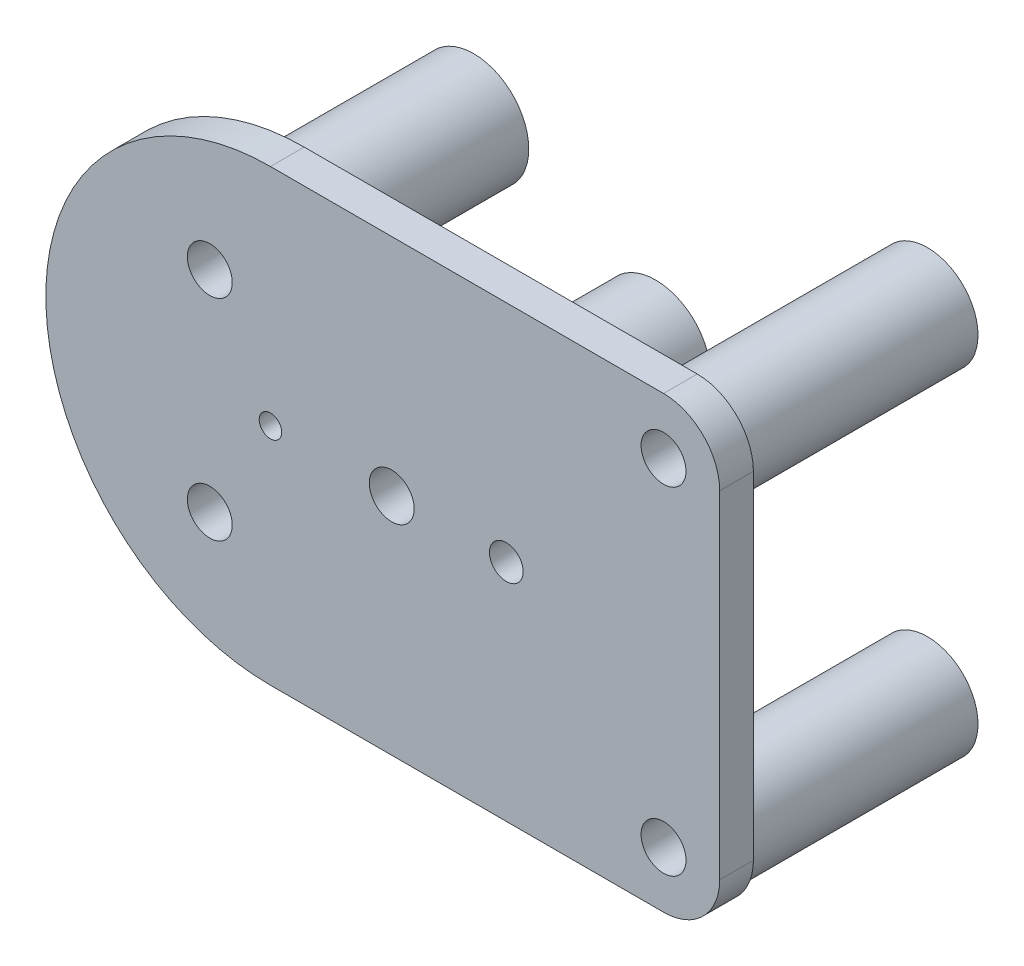
ISO-10303-21;
HEADER;
FILE_DESCRIPTION(('STEP AP214'),'2;1');
FILE_NAME('part.step','',(''),(''),'','','');
FILE_SCHEMA(('AUTOMOTIVE_DESIGN { 1 0 10303 214 1 1 1 1 }'));
ENDSEC;
DATA;
#1=APPLICATION_CONTEXT('core data for automotive mechanical design processes');
#2=APPLICATION_PROTOCOL_DEFINITION('international standard','automotive_design',2000,#1);
#3=PRODUCT_CONTEXT('',#1,'mechanical');
#4=PRODUCT('Part','Part','',(#3));
#5=PRODUCT_RELATED_PRODUCT_CATEGORY('part','',(#4));
#6=PRODUCT_DEFINITION_FORMATION('','',#4);
#7=PRODUCT_DEFINITION_CONTEXT('part definition',#1,'design');
#8=PRODUCT_DEFINITION('design','',#6,#7);
#9=PRODUCT_DEFINITION_SHAPE('','',#8);
#10=(LENGTH_UNIT() NAMED_UNIT(*) SI_UNIT(.MILLI.,.METRE.));
#11=(NAMED_UNIT(*) PLANE_ANGLE_UNIT() SI_UNIT($,.RADIAN.));
#12=(NAMED_UNIT(*) SI_UNIT($,.STERADIAN.) SOLID_ANGLE_UNIT());
#13=UNCERTAINTY_MEASURE_WITH_UNIT(LENGTH_MEASURE(1.E-05),#10,'distance_accuracy_value','');
#14=(GEOMETRIC_REPRESENTATION_CONTEXT(3) GLOBAL_UNCERTAINTY_ASSIGNED_CONTEXT((#13)) GLOBAL_UNIT_ASSIGNED_CONTEXT((#10,
#11,#12)) REPRESENTATION_CONTEXT('',''));
#15=CARTESIAN_POINT('',(0.,0.,0.));
#16=DIRECTION('',(0.,0.,1.));
#17=DIRECTION('',(1.,0.,0.));
#18=AXIS2_PLACEMENT_3D('',#15,#16,#17);
#19=CARTESIAN_POINT('',(0.,0.,0.));
#20=DIRECTION('',(0.,0.,1.));
#21=DIRECTION('',(1.,0.,0.));
#22=AXIS2_PLACEMENT_3D('',#19,#20,#21);
#23=PLANE('',#22);
#24=CARTESIAN_POINT('',(35.,15.,0.));
#25=DIRECTION('',(0.,0.,1.));
#26=DIRECTION('',(1.,0.,0.));
#27=AXIS2_PLACEMENT_3D('',#24,#25,#26);
#28=CIRCLE('',#27,4.5);
#29=CARTESIAN_POINT('',(39.5,15.,0.));
#30=VERTEX_POINT('',#29);
#31=EDGE_CURVE('E54',#30,#30,#28,.F.);
#32=ORIENTED_EDGE('',*,*,#31,.F.);
#33=EDGE_LOOP('',(#32));
#34=FACE_BOUND('',#33,.T.);
#35=CARTESIAN_POINT('',(-5.40000000000001,-9.35307436087194,0.));
#36=DIRECTION('',(0.,0.,1.));
#37=DIRECTION('',(1.,0.,0.));
#38=AXIS2_PLACEMENT_3D('',#35,#36,#37);
#39=CIRCLE('',#38,4.9);
#40=CARTESIAN_POINT('',(-0.500000000000002,-9.35307436087194,0.));
#41=VERTEX_POINT('',#40);
#42=EDGE_CURVE('E183',#41,#41,#39,.F.);
#43=ORIENTED_EDGE('',*,*,#42,.F.);
#44=EDGE_LOOP('',(#43));
#45=FACE_BOUND('',#44,.T.);
#46=CARTESIAN_POINT('',(-5.4,9.35307436087194,0.));
#47=DIRECTION('',(0.,0.,1.));
#48=DIRECTION('',(1.,0.,0.));
#49=AXIS2_PLACEMENT_3D('',#46,#47,#48);
#50=CIRCLE('',#49,4.9);
#51=CARTESIAN_POINT('',(-0.499999999999995,9.35307436087194,0.));
#52=VERTEX_POINT('',#51);
#53=EDGE_CURVE('E179',#52,#52,#50,.F.);
#54=ORIENTED_EDGE('',*,*,#53,.F.);
#55=EDGE_LOOP('',(#54));
#56=FACE_BOUND('',#55,.T.);
#57=CARTESIAN_POINT('',(10.8,0.,0.));
#58=DIRECTION('',(0.,0.,1.));
#59=DIRECTION('',(1.,0.,0.));
#60=AXIS2_PLACEMENT_3D('',#57,#58,#59);
#61=CIRCLE('',#60,4.9);
#62=CARTESIAN_POINT('',(15.7,0.,0.));
#63=VERTEX_POINT('',#62);
#64=EDGE_CURVE('E118',#63,#63,#61,.F.);
#65=ORIENTED_EDGE('',*,*,#64,.F.);
#66=EDGE_LOOP('',(#65));
#67=FACE_BOUND('',#66,.T.);
#68=DIRECTION('',(0.,-1.,0.));
#69=VECTOR('',#68,1.);
#70=CARTESIAN_POINT('',(40.,0.,0.));
#71=LINE('',#70,#69);
#72=CARTESIAN_POINT('',(40.,15.,0.));
#73=VERTEX_POINT('',#72);
#74=CARTESIAN_POINT('',(40.,-15.,0.));
#75=VERTEX_POINT('',#74);
#76=EDGE_CURVE('E157',#73,#75,#71,.T.);
#77=ORIENTED_EDGE('',*,*,#76,.T.);
#78=CARTESIAN_POINT('',(35.,-15.,0.));
#79=DIRECTION('',(0.,0.,1.));
#80=DIRECTION('',(1.,0.,0.));
#81=AXIS2_PLACEMENT_3D('',#78,#79,#80);
#82=CIRCLE('',#81,5.);
#83=CARTESIAN_POINT('',(35.,-20.,0.));
#84=VERTEX_POINT('',#83);
#85=EDGE_CURVE('E195',#75,#84,#82,.F.);
#86=ORIENTED_EDGE('',*,*,#85,.T.);
#87=DIRECTION('',(1.,0.,0.));
#88=VECTOR('',#87,1.);
#89=CARTESIAN_POINT('',(0.,-20.,0.));
#90=LINE('',#89,#88);
#91=CARTESIAN_POINT('',(0.,-20.,0.));
#92=VERTEX_POINT('',#91);
#93=EDGE_CURVE('E155',#92,#84,#90,.T.);
#94=ORIENTED_EDGE('',*,*,#93,.F.);
#95=CARTESIAN_POINT('',(0.,0.,0.));
#96=DIRECTION('',(0.,0.,1.));
#97=DIRECTION('',(1.,0.,0.));
#98=AXIS2_PLACEMENT_3D('',#95,#96,#97);
#99=CIRCLE('',#98,20.);
#100=CARTESIAN_POINT('',(0.,20.,0.));
#101=VERTEX_POINT('',#100);
#102=EDGE_CURVE('E163',#101,#92,#99,.T.);
#103=ORIENTED_EDGE('',*,*,#102,.F.);
#104=DIRECTION('',(1.,0.,0.));
#105=VECTOR('',#104,1.);
#106=CARTESIAN_POINT('',(0.,20.,0.));
#107=LINE('',#106,#105);
#108=CARTESIAN_POINT('',(35.,20.,0.));
#109=VERTEX_POINT('',#108);
#110=EDGE_CURVE('E114',#101,#109,#107,.T.);
#111=ORIENTED_EDGE('',*,*,#110,.T.);
#112=CARTESIAN_POINT('',(35.,15.,0.));
#113=DIRECTION('',(0.,0.,1.));
#114=DIRECTION('',(1.,0.,0.));
#115=AXIS2_PLACEMENT_3D('',#112,#113,#114);
#116=CIRCLE('',#115,5.);
#117=EDGE_CURVE('E193',#109,#73,#116,.F.);
#118=ORIENTED_EDGE('',*,*,#117,.T.);
#119=EDGE_LOOP('',(#77,#86,#94,#103,#111,#118));
#120=FACE_BOUND('',#119,.T.);
#121=CARTESIAN_POINT('',(21.,0.,0.));
#122=DIRECTION('',(0.,0.,1.));
#123=DIRECTION('',(1.,0.,0.));
#124=AXIS2_PLACEMENT_3D('',#121,#122,#123);
#125=CIRCLE('',#124,1.5);
#126=CARTESIAN_POINT('',(22.5,0.,0.));
#127=VERTEX_POINT('',#126);
#128=EDGE_CURVE('E166',#127,#127,#125,.T.);
#129=ORIENTED_EDGE('',*,*,#128,.T.);
#130=EDGE_LOOP('',(#129));
#131=FACE_BOUND('',#130,.T.);
#132=CARTESIAN_POINT('',(0.,0.,0.));
#133=DIRECTION('',(0.,0.,1.));
#134=DIRECTION('',(1.,0.,0.));
#135=AXIS2_PLACEMENT_3D('',#132,#133,#134);
#136=CIRCLE('',#135,1.);
#137=CARTESIAN_POINT('',(1.,0.,0.));
#138=VERTEX_POINT('',#137);
#139=EDGE_CURVE('E170',#138,#138,#136,.T.);
#140=ORIENTED_EDGE('',*,*,#139,.T.);
#141=EDGE_LOOP('',(#140));
#142=FACE_BOUND('',#141,.T.);
#143=CARTESIAN_POINT('',(35.,-15.,0.));
#144=DIRECTION('',(0.,0.,1.));
#145=DIRECTION('',(1.,0.,0.));
#146=AXIS2_PLACEMENT_3D('',#143,#144,#145);
#147=CIRCLE('',#146,4.5);
#148=CARTESIAN_POINT('',(39.5,-15.,0.));
#149=VERTEX_POINT('',#148);
#150=EDGE_CURVE('E11',#149,#149,#147,.F.);
#151=ORIENTED_EDGE('',*,*,#150,.F.);
#152=EDGE_LOOP('',(#151));
#153=FACE_BOUND('',#152,.T.);
#154=ADVANCED_FACE('F45',(#34,#45,#56,#67,#120,#131,#142,#153),#23,.F.);
#155=CARTESIAN_POINT('',(0.,-20.,3.));
#156=DIRECTION('',(0.,1.,0.));
#157=DIRECTION('',(0.,0.,1.));
#158=AXIS2_PLACEMENT_3D('',#155,#156,#157);
#159=PLANE('',#158);
#160=ORIENTED_EDGE('',*,*,#93,.T.);
#161=DIRECTION('',(0.,0.,-1.));
#162=VECTOR('',#161,1.);
#163=CARTESIAN_POINT('',(35.,-20.,3.));
#164=LINE('',#163,#162);
#165=CARTESIAN_POINT('',(35.,-20.,3.));
#166=VERTEX_POINT('',#165);
#167=EDGE_CURVE('E69',#84,#166,#164,.F.);
#168=ORIENTED_EDGE('',*,*,#167,.T.);
#169=DIRECTION('',(1.,0.,0.));
#170=VECTOR('',#169,1.);
#171=CARTESIAN_POINT('',(0.,-20.,3.));
#172=LINE('',#171,#170);
#173=CARTESIAN_POINT('',(0.,-20.,3.));
#174=VERTEX_POINT('',#173);
#175=EDGE_CURVE('E137',#174,#166,#172,.T.);
#176=ORIENTED_EDGE('',*,*,#175,.F.);
#177=DIRECTION('',(0.,0.,-1.));
#178=VECTOR('',#177,1.);
#179=CARTESIAN_POINT('',(0.,-20.,3.));
#180=LINE('',#179,#178);
#181=EDGE_CURVE('E119',#174,#92,#180,.T.);
#182=ORIENTED_EDGE('',*,*,#181,.T.);
#183=EDGE_LOOP('',(#160,#168,#176,#182));
#184=FACE_BOUND('',#183,.T.);
#185=ADVANCED_FACE('F211',(#184),#159,.F.);
#186=CARTESIAN_POINT('',(40.,0.,3.));
#187=DIRECTION('',(1.,0.,0.));
#188=DIRECTION('',(0.,0.,-1.));
#189=AXIS2_PLACEMENT_3D('',#186,#187,#188);
#190=PLANE('',#189);
#191=DIRECTION('',(0.,-1.,0.));
#192=VECTOR('',#191,1.);
#193=CARTESIAN_POINT('',(40.,0.,3.));
#194=LINE('',#193,#192);
#195=CARTESIAN_POINT('',(40.,15.,3.));
#196=VERTEX_POINT('',#195);
#197=CARTESIAN_POINT('',(40.,-15.,3.));
#198=VERTEX_POINT('',#197);
#199=EDGE_CURVE('E131',#196,#198,#194,.T.);
#200=ORIENTED_EDGE('',*,*,#199,.T.);
#201=DIRECTION('',(0.,0.,-1.));
#202=VECTOR('',#201,1.);
#203=CARTESIAN_POINT('',(40.,-15.,0.));
#204=LINE('',#203,#202);
#205=EDGE_CURVE('E190',#198,#75,#204,.T.);
#206=ORIENTED_EDGE('',*,*,#205,.T.);
#207=ORIENTED_EDGE('',*,*,#76,.F.);
#208=DIRECTION('',(0.,0.,-1.));
#209=VECTOR('',#208,1.);
#210=CARTESIAN_POINT('',(40.,15.,3.));
#211=LINE('',#210,#209);
#212=EDGE_CURVE('E187',#73,#196,#211,.F.);
#213=ORIENTED_EDGE('',*,*,#212,.T.);
#214=EDGE_LOOP('',(#200,#206,#207,#213));
#215=FACE_BOUND('',#214,.T.);
#216=ADVANCED_FACE('F288',(#215),#190,.T.);
#217=CARTESIAN_POINT('',(0.,20.,3.));
#218=DIRECTION('',(0.,1.,0.));
#219=DIRECTION('',(0.,0.,1.));
#220=AXIS2_PLACEMENT_3D('',#217,#218,#219);
#221=PLANE('',#220);
#222=DIRECTION('',(1.,0.,0.));
#223=VECTOR('',#222,1.);
#224=CARTESIAN_POINT('',(0.,20.,3.));
#225=LINE('',#224,#223);
#226=CARTESIAN_POINT('',(0.,20.,3.));
#227=VERTEX_POINT('',#226);
#228=CARTESIAN_POINT('',(35.,20.,3.));
#229=VERTEX_POINT('',#228);
#230=EDGE_CURVE('E111',#227,#229,#225,.T.);
#231=ORIENTED_EDGE('',*,*,#230,.T.);
#232=DIRECTION('',(0.,0.,-1.));
#233=VECTOR('',#232,1.);
#234=CARTESIAN_POINT('',(35.,20.,3.));
#235=LINE('',#234,#233);
#236=EDGE_CURVE('E202',#229,#109,#235,.T.);
#237=ORIENTED_EDGE('',*,*,#236,.T.);
#238=ORIENTED_EDGE('',*,*,#110,.F.);
#239=DIRECTION('',(0.,0.,-1.));
#240=VECTOR('',#239,1.);
#241=CARTESIAN_POINT('',(0.,20.,3.));
#242=LINE('',#241,#240);
#243=EDGE_CURVE('E107',#227,#101,#242,.T.);
#244=ORIENTED_EDGE('',*,*,#243,.F.);
#245=EDGE_LOOP('',(#231,#237,#238,#244));
#246=FACE_BOUND('',#245,.T.);
#247=ADVANCED_FACE('F109',(#246),#221,.T.);
#248=CARTESIAN_POINT('',(35.,-15.,3.));
#249=DIRECTION('',(0.,0.,-1.));
#250=DIRECTION('',(-1.,0.,0.));
#251=AXIS2_PLACEMENT_3D('',#248,#249,#250);
#252=CYLINDRICAL_SURFACE('',#251,2.);
#253=CARTESIAN_POINT('',(35.,-15.,3.));
#254=DIRECTION('',(0.,0.,1.));
#255=DIRECTION('',(1.,0.,0.));
#256=AXIS2_PLACEMENT_3D('',#253,#254,#255);
#257=CIRCLE('',#256,2.);
#258=CARTESIAN_POINT('',(37.,-15.,3.));
#259=VERTEX_POINT('',#258);
#260=EDGE_CURVE('E148',#259,#259,#257,.F.);
#261=ORIENTED_EDGE('',*,*,#260,.F.);
#262=EDGE_LOOP('',(#261));
#263=FACE_BOUND('',#262,.T.);
#264=CARTESIAN_POINT('',(35.,-15.,-20.5));
#265=DIRECTION('',(0.,0.,-1.));
#266=DIRECTION('',(-1.,0.,0.));
#267=AXIS2_PLACEMENT_3D('',#264,#265,#266);
#268=CIRCLE('',#267,2.);
#269=CARTESIAN_POINT('',(33.,-15.,-20.5));
#270=VERTEX_POINT('',#269);
#271=EDGE_CURVE('E237',#270,#270,#268,.T.);
#272=ORIENTED_EDGE('',*,*,#271,.T.);
#273=EDGE_LOOP('',(#272));
#274=FACE_BOUND('',#273,.T.);
#275=ADVANCED_FACE('F353',(#263,#274),#252,.F.);
#276=CARTESIAN_POINT('',(0.,0.,3.));
#277=DIRECTION('',(0.,0.,-1.));
#278=DIRECTION('',(-1.,0.,0.));
#279=AXIS2_PLACEMENT_3D('',#276,#277,#278);
#280=CYLINDRICAL_SURFACE('',#279,1.);
#281=CARTESIAN_POINT('',(0.,0.,3.));
#282=DIRECTION('',(0.,0.,1.));
#283=DIRECTION('',(1.,0.,0.));
#284=AXIS2_PLACEMENT_3D('',#281,#282,#283);
#285=CIRCLE('',#284,1.);
#286=CARTESIAN_POINT('',(1.,0.,3.));
#287=VERTEX_POINT('',#286);
#288=EDGE_CURVE('E144',#287,#287,#285,.T.);
#289=ORIENTED_EDGE('',*,*,#288,.T.);
#290=EDGE_LOOP('',(#289));
#291=FACE_BOUND('',#290,.T.);
#292=ORIENTED_EDGE('',*,*,#139,.F.);
#293=EDGE_LOOP('',(#292));
#294=FACE_BOUND('',#293,.T.);
#295=ADVANCED_FACE('F356',(#291,#294),#280,.F.);
#296=CARTESIAN_POINT('',(21.,0.,3.));
#297=DIRECTION('',(0.,0.,-1.));
#298=DIRECTION('',(-1.,0.,0.));
#299=AXIS2_PLACEMENT_3D('',#296,#297,#298);
#300=CYLINDRICAL_SURFACE('',#299,1.5);
#301=CARTESIAN_POINT('',(21.,0.,3.));
#302=DIRECTION('',(0.,0.,1.));
#303=DIRECTION('',(1.,0.,0.));
#304=AXIS2_PLACEMENT_3D('',#301,#302,#303);
#305=CIRCLE('',#304,1.5);
#306=CARTESIAN_POINT('',(22.5,0.,3.));
#307=VERTEX_POINT('',#306);
#308=EDGE_CURVE('E126',#307,#307,#305,.T.);
#309=ORIENTED_EDGE('',*,*,#308,.T.);
#310=EDGE_LOOP('',(#309));
#311=FACE_BOUND('',#310,.T.);
#312=ORIENTED_EDGE('',*,*,#128,.F.);
#313=EDGE_LOOP('',(#312));
#314=FACE_BOUND('',#313,.T.);
#315=ADVANCED_FACE('F360',(#311,#314),#300,.F.);
#316=CARTESIAN_POINT('',(0.,0.,3.));
#317=DIRECTION('',(0.,0.,-1.));
#318=DIRECTION('',(-1.,0.,0.));
#319=AXIS2_PLACEMENT_3D('',#316,#317,#318);
#320=CYLINDRICAL_SURFACE('',#319,20.);
#321=ORIENTED_EDGE('',*,*,#102,.T.);
#322=ORIENTED_EDGE('',*,*,#181,.F.);
#323=CARTESIAN_POINT('',(0.,0.,3.));
#324=DIRECTION('',(0.,0.,1.));
#325=DIRECTION('',(1.,0.,0.));
#326=AXIS2_PLACEMENT_3D('',#323,#324,#325);
#327=CIRCLE('',#326,20.);
#328=EDGE_CURVE('E122',#227,#174,#327,.T.);
#329=ORIENTED_EDGE('',*,*,#328,.F.);
#330=ORIENTED_EDGE('',*,*,#243,.T.);
#331=EDGE_LOOP('',(#321,#322,#329,#330));
#332=FACE_BOUND('',#331,.T.);
#333=ADVANCED_FACE('F123',(#332),#320,.T.);
#334=CARTESIAN_POINT('',(35.,15.,3.));
#335=DIRECTION('',(0.,0.,-1.));
#336=DIRECTION('',(-1.,0.,0.));
#337=AXIS2_PLACEMENT_3D('',#334,#335,#336);
#338=CYLINDRICAL_SURFACE('',#337,2.);
#339=CARTESIAN_POINT('',(35.,15.,3.));
#340=DIRECTION('',(0.,0.,1.));
#341=DIRECTION('',(1.,0.,0.));
#342=AXIS2_PLACEMENT_3D('',#339,#340,#341);
#343=CIRCLE('',#342,2.);
#344=CARTESIAN_POINT('',(37.,15.,3.));
#345=VERTEX_POINT('',#344);
#346=EDGE_CURVE('E152',#345,#345,#343,.T.);
#347=ORIENTED_EDGE('',*,*,#346,.T.);
#348=EDGE_LOOP('',(#347));
#349=FACE_BOUND('',#348,.T.);
#350=CARTESIAN_POINT('',(35.,15.,-20.5));
#351=DIRECTION('',(0.,0.,-1.));
#352=DIRECTION('',(-1.,0.,0.));
#353=AXIS2_PLACEMENT_3D('',#350,#351,#352);
#354=CIRCLE('',#353,2.);
#355=CARTESIAN_POINT('',(33.,15.,-20.5));
#356=VERTEX_POINT('',#355);
#357=EDGE_CURVE('E240',#356,#356,#354,.T.);
#358=ORIENTED_EDGE('',*,*,#357,.T.);
#359=EDGE_LOOP('',(#358));
#360=FACE_BOUND('',#359,.T.);
#361=ADVANCED_FACE('F347',(#349,#360),#338,.F.);
#362=CARTESIAN_POINT('',(0.,0.,3.));
#363=DIRECTION('',(0.,0.,1.));
#364=DIRECTION('',(1.,0.,0.));
#365=AXIS2_PLACEMENT_3D('',#362,#363,#364);
#366=PLANE('',#365);
#367=CARTESIAN_POINT('',(10.8,0.,3.));
#368=DIRECTION('',(0.,0.,-1.));
#369=DIRECTION('',(-1.,0.,0.));
#370=AXIS2_PLACEMENT_3D('',#367,#368,#369);
#371=CIRCLE('',#370,2.);
#372=CARTESIAN_POINT('',(8.8,0.,3.));
#373=VERTEX_POINT('',#372);
#374=EDGE_CURVE('E249',#373,#373,#371,.T.);
#375=ORIENTED_EDGE('',*,*,#374,.T.);
#376=EDGE_LOOP('',(#375));
#377=FACE_BOUND('',#376,.T.);
#378=CARTESIAN_POINT('',(-5.40000000000005,9.35307436087191,3.));
#379=DIRECTION('',(0.,0.,-1.));
#380=DIRECTION('',(-1.,0.,0.));
#381=AXIS2_PLACEMENT_3D('',#378,#379,#380);
#382=CIRCLE('',#381,2.);
#383=CARTESIAN_POINT('',(-7.40000000000005,9.35307436087191,3.));
#384=VERTEX_POINT('',#383);
#385=EDGE_CURVE('E262',#384,#384,#382,.T.);
#386=ORIENTED_EDGE('',*,*,#385,.T.);
#387=EDGE_LOOP('',(#386));
#388=FACE_BOUND('',#387,.T.);
#389=CARTESIAN_POINT('',(-5.39999999999992,-9.35307436087199,3.));
#390=DIRECTION('',(0.,0.,-1.));
#391=DIRECTION('',(-1.,0.,0.));
#392=AXIS2_PLACEMENT_3D('',#389,#390,#391);
#393=CIRCLE('',#392,2.);
#394=CARTESIAN_POINT('',(-7.39999999999992,-9.35307436087199,3.));
#395=VERTEX_POINT('',#394);
#396=EDGE_CURVE('E246',#395,#395,#393,.T.);
#397=ORIENTED_EDGE('',*,*,#396,.T.);
#398=EDGE_LOOP('',(#397));
#399=FACE_BOUND('',#398,.T.);
#400=ORIENTED_EDGE('',*,*,#175,.T.);
#401=CARTESIAN_POINT('',(35.,-15.,3.));
#402=DIRECTION('',(0.,0.,1.));
#403=DIRECTION('',(1.,0.,0.));
#404=AXIS2_PLACEMENT_3D('',#401,#402,#403);
#405=CIRCLE('',#404,5.);
#406=EDGE_CURVE('E200',#166,#198,#405,.T.);
#407=ORIENTED_EDGE('',*,*,#406,.T.);
#408=ORIENTED_EDGE('',*,*,#199,.F.);
#409=CARTESIAN_POINT('',(35.,15.,3.));
#410=DIRECTION('',(0.,0.,1.));
#411=DIRECTION('',(1.,0.,0.));
#412=AXIS2_PLACEMENT_3D('',#409,#410,#411);
#413=CIRCLE('',#412,5.);
#414=EDGE_CURVE('E61',#196,#229,#413,.T.);
#415=ORIENTED_EDGE('',*,*,#414,.T.);
#416=ORIENTED_EDGE('',*,*,#230,.F.);
#417=ORIENTED_EDGE('',*,*,#328,.T.);
#418=EDGE_LOOP('',(#400,#407,#408,#415,#416,#417));
#419=FACE_BOUND('',#418,.T.);
#420=ORIENTED_EDGE('',*,*,#308,.F.);
#421=EDGE_LOOP('',(#420));
#422=FACE_BOUND('',#421,.T.);
#423=ORIENTED_EDGE('',*,*,#288,.F.);
#424=EDGE_LOOP('',(#423));
#425=FACE_BOUND('',#424,.T.);
#426=ORIENTED_EDGE('',*,*,#260,.T.);
#427=EDGE_LOOP('',(#426));
#428=FACE_BOUND('',#427,.T.);
#429=ORIENTED_EDGE('',*,*,#346,.F.);
#430=EDGE_LOOP('',(#429));
#431=FACE_BOUND('',#430,.T.);
#432=ADVANCED_FACE('F128',(#377,#388,#399,#419,#422,#425,#428,#431),#366,.T.);
#433=CARTESIAN_POINT('',(10.8,0.,-20.5));
#434=DIRECTION('',(0.,0.,1.));
#435=DIRECTION('',(1.,0.,0.));
#436=AXIS2_PLACEMENT_3D('',#433,#434,#435);
#437=CYLINDRICAL_SURFACE('',#436,4.9);
#438=CARTESIAN_POINT('',(10.8,0.,-20.5));
#439=DIRECTION('',(0.,0.,-1.));
#440=DIRECTION('',(-1.,0.,0.));
#441=AXIS2_PLACEMENT_3D('',#438,#439,#440);
#442=CIRCLE('',#441,4.9);
#443=CARTESIAN_POINT('',(5.9,0.,-20.5));
#444=VERTEX_POINT('',#443);
#445=EDGE_CURVE('E158',#444,#444,#442,.T.);
#446=ORIENTED_EDGE('',*,*,#445,.F.);
#447=EDGE_LOOP('',(#446));
#448=FACE_BOUND('',#447,.T.);
#449=ORIENTED_EDGE('',*,*,#64,.T.);
#450=EDGE_LOOP('',(#449));
#451=FACE_BOUND('',#450,.T.);
#452=ADVANCED_FACE('F341',(#448,#451),#437,.T.);
#453=CARTESIAN_POINT('',(10.8,0.,-20.5));
#454=DIRECTION('',(0.,0.,-1.));
#455=DIRECTION('',(-1.,0.,0.));
#456=AXIS2_PLACEMENT_3D('',#453,#454,#455);
#457=PLANE('',#456);
#458=CARTESIAN_POINT('',(10.8,0.,-20.5));
#459=DIRECTION('',(0.,0.,-1.));
#460=DIRECTION('',(-1.,0.,0.));
#461=AXIS2_PLACEMENT_3D('',#458,#459,#460);
#462=CIRCLE('',#461,2.);
#463=CARTESIAN_POINT('',(8.8,0.,-20.5));
#464=VERTEX_POINT('',#463);
#465=EDGE_CURVE('E254',#464,#464,#462,.T.);
#466=ORIENTED_EDGE('',*,*,#465,.F.);
#467=EDGE_LOOP('',(#466));
#468=FACE_BOUND('',#467,.T.);
#469=ORIENTED_EDGE('',*,*,#445,.T.);
#470=EDGE_LOOP('',(#469));
#471=FACE_BOUND('',#470,.T.);
#472=ADVANCED_FACE('F334',(#468,#471),#457,.T.);
#473=CARTESIAN_POINT('',(-5.4,9.35307436087194,-20.5));
#474=DIRECTION('',(0.,0.,1.));
#475=DIRECTION('',(1.,0.,0.));
#476=AXIS2_PLACEMENT_3D('',#473,#474,#475);
#477=CYLINDRICAL_SURFACE('',#476,4.9);
#478=CARTESIAN_POINT('',(-5.4,9.35307436087194,-20.5));
#479=DIRECTION('',(0.,0.,-1.));
#480=DIRECTION('',(-1.,0.,0.));
#481=AXIS2_PLACEMENT_3D('',#478,#479,#480);
#482=CIRCLE('',#481,4.9);
#483=CARTESIAN_POINT('',(-10.3,9.35307436087194,-20.5));
#484=VERTEX_POINT('',#483);
#485=EDGE_CURVE('E276',#484,#484,#482,.T.);
#486=ORIENTED_EDGE('',*,*,#485,.F.);
#487=EDGE_LOOP('',(#486));
#488=FACE_BOUND('',#487,.T.);
#489=ORIENTED_EDGE('',*,*,#53,.T.);
#490=EDGE_LOOP('',(#489));
#491=FACE_BOUND('',#490,.T.);
#492=ADVANCED_FACE('F331',(#488,#491),#477,.T.);
#493=CARTESIAN_POINT('',(-5.4,9.35307436087194,-20.5));
#494=DIRECTION('',(0.,0.,-1.));
#495=DIRECTION('',(-1.,0.,0.));
#496=AXIS2_PLACEMENT_3D('',#493,#494,#495);
#497=PLANE('',#496);
#498=CARTESIAN_POINT('',(-5.40000000000005,9.35307436087191,-20.5));
#499=DIRECTION('',(0.,0.,-1.));
#500=DIRECTION('',(-1.,0.,0.));
#501=AXIS2_PLACEMENT_3D('',#498,#499,#500);
#502=CIRCLE('',#501,2.);
#503=CARTESIAN_POINT('',(-7.40000000000005,9.35307436087191,-20.5));
#504=VERTEX_POINT('',#503);
#505=EDGE_CURVE('E258',#504,#504,#502,.T.);
#506=ORIENTED_EDGE('',*,*,#505,.F.);
#507=EDGE_LOOP('',(#506));
#508=FACE_BOUND('',#507,.T.);
#509=ORIENTED_EDGE('',*,*,#485,.T.);
#510=EDGE_LOOP('',(#509));
#511=FACE_BOUND('',#510,.T.);
#512=ADVANCED_FACE('F326',(#508,#511),#497,.T.);
#513=CARTESIAN_POINT('',(-5.40000000000001,-9.35307436087194,-20.5));
#514=DIRECTION('',(0.,0.,1.));
#515=DIRECTION('',(1.,0.,0.));
#516=AXIS2_PLACEMENT_3D('',#513,#514,#515);
#517=CYLINDRICAL_SURFACE('',#516,4.9);
#518=CARTESIAN_POINT('',(-5.40000000000001,-9.35307436087194,-20.5));
#519=DIRECTION('',(0.,0.,-1.));
#520=DIRECTION('',(-1.,0.,0.));
#521=AXIS2_PLACEMENT_3D('',#518,#519,#520);
#522=CIRCLE('',#521,4.9);
#523=CARTESIAN_POINT('',(-10.3,-9.35307436087194,-20.5));
#524=VERTEX_POINT('',#523);
#525=EDGE_CURVE('E253',#524,#524,#522,.T.);
#526=ORIENTED_EDGE('',*,*,#525,.F.);
#527=EDGE_LOOP('',(#526));
#528=FACE_BOUND('',#527,.T.);
#529=ORIENTED_EDGE('',*,*,#42,.T.);
#530=EDGE_LOOP('',(#529));
#531=FACE_BOUND('',#530,.T.);
#532=ADVANCED_FACE('F323',(#528,#531),#517,.T.);
#533=CARTESIAN_POINT('',(-5.40000000000001,-9.35307436087194,-20.5));
#534=DIRECTION('',(0.,0.,-1.));
#535=DIRECTION('',(-1.,0.,0.));
#536=AXIS2_PLACEMENT_3D('',#533,#534,#535);
#537=PLANE('',#536);
#538=CARTESIAN_POINT('',(-5.39999999999992,-9.35307436087199,-20.5));
#539=DIRECTION('',(0.,0.,-1.));
#540=DIRECTION('',(-1.,0.,0.));
#541=AXIS2_PLACEMENT_3D('',#538,#539,#540);
#542=CIRCLE('',#541,2.);
#543=CARTESIAN_POINT('',(-7.39999999999992,-9.35307436087199,-20.5));
#544=VERTEX_POINT('',#543);
#545=EDGE_CURVE('E266',#544,#544,#542,.T.);
#546=ORIENTED_EDGE('',*,*,#545,.F.);
#547=EDGE_LOOP('',(#546));
#548=FACE_BOUND('',#547,.T.);
#549=ORIENTED_EDGE('',*,*,#525,.T.);
#550=EDGE_LOOP('',(#549));
#551=FACE_BOUND('',#550,.T.);
#552=ADVANCED_FACE('F321',(#548,#551),#537,.T.);
#553=CARTESIAN_POINT('',(-5.39999999999992,-9.35307436087199,3.));
#554=DIRECTION('',(0.,0.,-1.));
#555=DIRECTION('',(-1.,0.,0.));
#556=AXIS2_PLACEMENT_3D('',#553,#554,#555);
#557=CYLINDRICAL_SURFACE('',#556,2.);
#558=ORIENTED_EDGE('',*,*,#396,.F.);
#559=EDGE_LOOP('',(#558));
#560=FACE_BOUND('',#559,.T.);
#561=ORIENTED_EDGE('',*,*,#545,.T.);
#562=EDGE_LOOP('',(#561));
#563=FACE_BOUND('',#562,.T.);
#564=ADVANCED_FACE('F311',(#560,#563),#557,.F.);
#565=CARTESIAN_POINT('',(-5.40000000000005,9.35307436087191,3.));
#566=DIRECTION('',(0.,0.,-1.));
#567=DIRECTION('',(-1.,0.,0.));
#568=AXIS2_PLACEMENT_3D('',#565,#566,#567);
#569=CYLINDRICAL_SURFACE('',#568,2.);
#570=ORIENTED_EDGE('',*,*,#385,.F.);
#571=EDGE_LOOP('',(#570));
#572=FACE_BOUND('',#571,.T.);
#573=ORIENTED_EDGE('',*,*,#505,.T.);
#574=EDGE_LOOP('',(#573));
#575=FACE_BOUND('',#574,.T.);
#576=ADVANCED_FACE('F305',(#572,#575),#569,.F.);
#577=CARTESIAN_POINT('',(10.8,0.,3.));
#578=DIRECTION('',(0.,0.,-1.));
#579=DIRECTION('',(-1.,0.,0.));
#580=AXIS2_PLACEMENT_3D('',#577,#578,#579);
#581=CYLINDRICAL_SURFACE('',#580,2.);
#582=ORIENTED_EDGE('',*,*,#374,.F.);
#583=EDGE_LOOP('',(#582));
#584=FACE_BOUND('',#583,.T.);
#585=ORIENTED_EDGE('',*,*,#465,.T.);
#586=EDGE_LOOP('',(#585));
#587=FACE_BOUND('',#586,.T.);
#588=ADVANCED_FACE('F300',(#584,#587),#581,.F.);
#589=CARTESIAN_POINT('',(35.,-15.,3.));
#590=DIRECTION('',(0.,0.,1.));
#591=DIRECTION('',(1.,0.,0.));
#592=AXIS2_PLACEMENT_3D('',#589,#590,#591);
#593=CYLINDRICAL_SURFACE('',#592,5.);
#594=ORIENTED_EDGE('',*,*,#406,.F.);
#595=ORIENTED_EDGE('',*,*,#167,.F.);
#596=ORIENTED_EDGE('',*,*,#85,.F.);
#597=ORIENTED_EDGE('',*,*,#205,.F.);
#598=EDGE_LOOP('',(#594,#595,#596,#597));
#599=FACE_BOUND('',#598,.T.);
#600=ADVANCED_FACE('F286',(#599),#593,.T.);
#601=CARTESIAN_POINT('',(35.,15.,3.));
#602=DIRECTION('',(0.,0.,-1.));
#603=DIRECTION('',(-1.,0.,0.));
#604=AXIS2_PLACEMENT_3D('',#601,#602,#603);
#605=CYLINDRICAL_SURFACE('',#604,5.);
#606=ORIENTED_EDGE('',*,*,#414,.F.);
#607=ORIENTED_EDGE('',*,*,#212,.F.);
#608=ORIENTED_EDGE('',*,*,#117,.F.);
#609=ORIENTED_EDGE('',*,*,#236,.F.);
#610=EDGE_LOOP('',(#606,#607,#608,#609));
#611=FACE_BOUND('',#610,.T.);
#612=ADVANCED_FACE('F47',(#611),#605,.T.);
#613=CARTESIAN_POINT('',(35.,15.,-33.2279220613579));
#614=DIRECTION('',(0.,0.,1.));
#615=DIRECTION('',(1.,0.,0.));
#616=AXIS2_PLACEMENT_3D('',#613,#614,#615);
#617=CYLINDRICAL_SURFACE('',#616,4.5);
#618=ORIENTED_EDGE('',*,*,#31,.T.);
#619=EDGE_LOOP('',(#618));
#620=FACE_BOUND('',#619,.T.);
#621=CARTESIAN_POINT('',(35.,15.,-20.5));
#622=DIRECTION('',(0.,0.,-1.));
#623=DIRECTION('',(-1.,0.,0.));
#624=AXIS2_PLACEMENT_3D('',#621,#622,#623);
#625=CIRCLE('',#624,4.5);
#626=CARTESIAN_POINT('',(30.5,15.,-20.5));
#627=VERTEX_POINT('',#626);
#628=EDGE_CURVE('E243',#627,#627,#625,.T.);
#629=ORIENTED_EDGE('',*,*,#628,.F.);
#630=EDGE_LOOP('',(#629));
#631=FACE_BOUND('',#630,.T.);
#632=ADVANCED_FACE('F206',(#620,#631),#617,.T.);
#633=CARTESIAN_POINT('',(10.8,0.,-20.5));
#634=DIRECTION('',(0.,0.,-1.));
#635=DIRECTION('',(-1.,0.,0.));
#636=AXIS2_PLACEMENT_3D('',#633,#634,#635);
#637=PLANE('',#636);
#638=ORIENTED_EDGE('',*,*,#357,.F.);
#639=EDGE_LOOP('',(#638));
#640=FACE_BOUND('',#639,.T.);
#641=ORIENTED_EDGE('',*,*,#628,.T.);
#642=EDGE_LOOP('',(#641));
#643=FACE_BOUND('',#642,.T.);
#644=ADVANCED_FACE('F231',(#640,#643),#637,.T.);
#645=CARTESIAN_POINT('',(35.,-15.,-33.2279220613579));
#646=DIRECTION('',(0.,0.,1.));
#647=DIRECTION('',(1.,0.,0.));
#648=AXIS2_PLACEMENT_3D('',#645,#646,#647);
#649=CYLINDRICAL_SURFACE('',#648,4.5);
#650=ORIENTED_EDGE('',*,*,#150,.T.);
#651=EDGE_LOOP('',(#650));
#652=FACE_BOUND('',#651,.T.);
#653=CARTESIAN_POINT('',(35.,-15.,-20.5));
#654=DIRECTION('',(0.,0.,-1.));
#655=DIRECTION('',(-1.,0.,0.));
#656=AXIS2_PLACEMENT_3D('',#653,#654,#655);
#657=CIRCLE('',#656,4.5);
#658=CARTESIAN_POINT('',(30.5,-15.,-20.5));
#659=VERTEX_POINT('',#658);
#660=EDGE_CURVE('E235',#659,#659,#657,.T.);
#661=ORIENTED_EDGE('',*,*,#660,.F.);
#662=EDGE_LOOP('',(#661));
#663=FACE_BOUND('',#662,.T.);
#664=ADVANCED_FACE('F227',(#652,#663),#649,.T.);
#665=CARTESIAN_POINT('',(10.8,0.,-20.5));
#666=DIRECTION('',(0.,0.,-1.));
#667=DIRECTION('',(-1.,0.,0.));
#668=AXIS2_PLACEMENT_3D('',#665,#666,#667);
#669=PLANE('',#668);
#670=ORIENTED_EDGE('',*,*,#271,.F.);
#671=EDGE_LOOP('',(#670));
#672=FACE_BOUND('',#671,.T.);
#673=ORIENTED_EDGE('',*,*,#660,.T.);
#674=EDGE_LOOP('',(#673));
#675=FACE_BOUND('',#674,.T.);
#676=ADVANCED_FACE('F230',(#672,#675),#669,.T.);
#677=CLOSED_SHELL('',(#154,#185,#216,#247,#275,#295,#315,#333,#361,#432,#452,#472,#492,#512,
#532,#552,#564,#576,#588,#600,#612,#632,#644,#664,#676));
#678=MANIFOLD_SOLID_BREP('B2',#677);
#679=ADVANCED_BREP_SHAPE_REPRESENTATION('',(#18,#678),#14);
#680=SHAPE_DEFINITION_REPRESENTATION(#9,#679);
ENDSEC;
END-ISO-10303-21;
